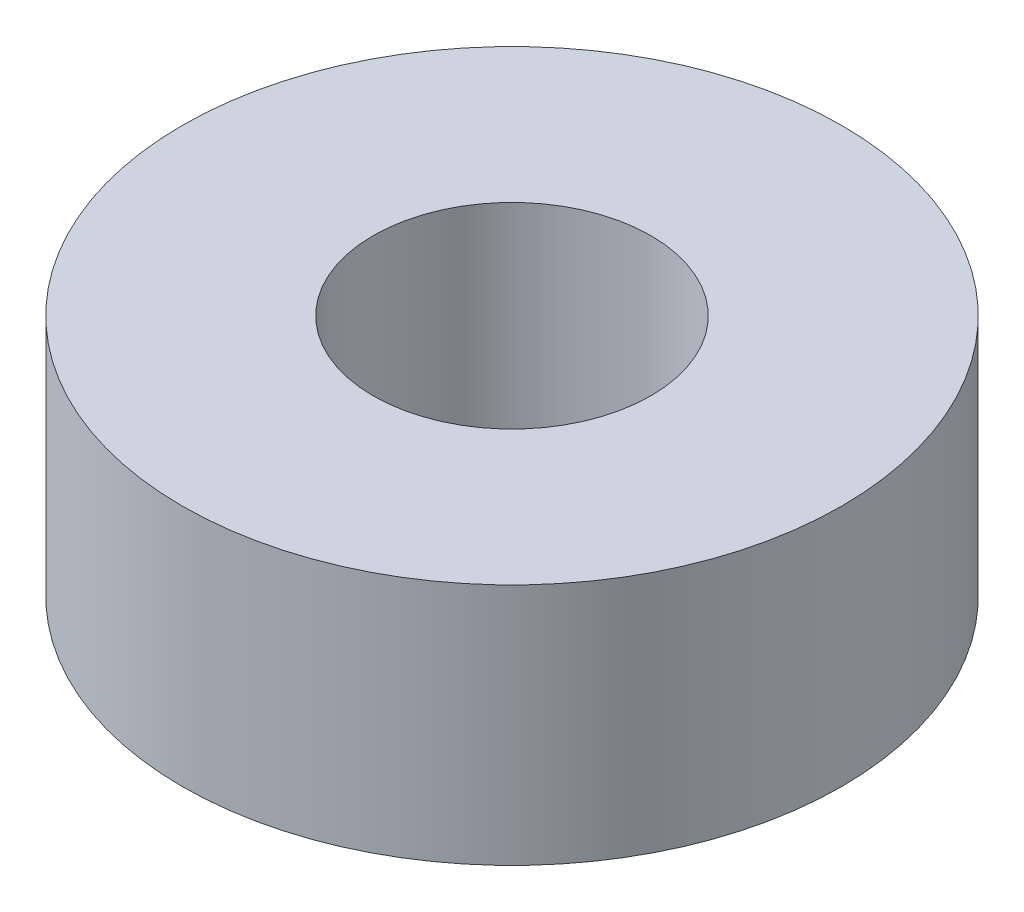
ISO-10303-21;
HEADER;
FILE_DESCRIPTION(('STEP AP214'),'2;1');
FILE_NAME('part.step','',(''),(''),'','','');
FILE_SCHEMA(('AUTOMOTIVE_DESIGN { 1 0 10303 214 1 1 1 1 }'));
ENDSEC;
DATA;
#1=APPLICATION_CONTEXT('core data for automotive mechanical design processes');
#2=APPLICATION_PROTOCOL_DEFINITION('international standard','automotive_design',2000,#1);
#3=PRODUCT_CONTEXT('',#1,'mechanical');
#4=PRODUCT('Part','Part','',(#3));
#5=PRODUCT_RELATED_PRODUCT_CATEGORY('part','',(#4));
#6=PRODUCT_DEFINITION_FORMATION('','',#4);
#7=PRODUCT_DEFINITION_CONTEXT('part definition',#1,'design');
#8=PRODUCT_DEFINITION('design','',#6,#7);
#9=PRODUCT_DEFINITION_SHAPE('','',#8);
#10=(LENGTH_UNIT() NAMED_UNIT(*) SI_UNIT(.MILLI.,.METRE.));
#11=(NAMED_UNIT(*) PLANE_ANGLE_UNIT() SI_UNIT($,.RADIAN.));
#12=(NAMED_UNIT(*) SI_UNIT($,.STERADIAN.) SOLID_ANGLE_UNIT());
#13=UNCERTAINTY_MEASURE_WITH_UNIT(LENGTH_MEASURE(1.E-05),#10,'distance_accuracy_value','');
#14=(GEOMETRIC_REPRESENTATION_CONTEXT(3) GLOBAL_UNCERTAINTY_ASSIGNED_CONTEXT((#13)) GLOBAL_UNIT_ASSIGNED_CONTEXT((#10,
#11,#12)) REPRESENTATION_CONTEXT('',''));
#15=CARTESIAN_POINT('',(0.,0.,0.));
#16=DIRECTION('',(0.,0.,1.));
#17=DIRECTION('',(1.,0.,0.));
#18=AXIS2_PLACEMENT_3D('',#15,#16,#17);
#19=CARTESIAN_POINT('',(0.,7.,0.));
#20=DIRECTION('',(0.,1.,0.));
#21=DIRECTION('',(0.,0.,1.));
#22=AXIS2_PLACEMENT_3D('',#19,#20,#21);
#23=PLANE('',#22);
#24=CARTESIAN_POINT('',(0.,7.,0.));
#25=DIRECTION('',(0.,1.,0.));
#26=DIRECTION('',(0.,0.,1.));
#27=AXIS2_PLACEMENT_3D('',#24,#25,#26);
#28=CIRCLE('',#27,9.5);
#29=CARTESIAN_POINT('',(0.,7.,9.5));
#30=VERTEX_POINT('',#29);
#31=EDGE_CURVE('E10',#30,#30,#28,.T.);
#32=ORIENTED_EDGE('',*,*,#31,.T.);
#33=EDGE_LOOP('',(#32));
#34=FACE_BOUND('',#33,.T.);
#35=CARTESIAN_POINT('',(0.,7.,0.));
#36=DIRECTION('',(0.,1.,0.));
#37=DIRECTION('',(0.,0.,1.));
#38=AXIS2_PLACEMENT_3D('',#35,#36,#37);
#39=CIRCLE('',#38,4.);
#40=CARTESIAN_POINT('',(0.,7.,4.));
#41=VERTEX_POINT('',#40);
#42=EDGE_CURVE('E50',#41,#41,#39,.T.);
#43=ORIENTED_EDGE('',*,*,#42,.F.);
#44=EDGE_LOOP('',(#43));
#45=FACE_BOUND('',#44,.T.);
#46=ADVANCED_FACE('F37',(#34,#45),#23,.T.);
#47=CARTESIAN_POINT('',(0.,0.,0.));
#48=DIRECTION('',(0.,1.,0.));
#49=DIRECTION('',(0.,0.,1.));
#50=AXIS2_PLACEMENT_3D('',#47,#48,#49);
#51=PLANE('',#50);
#52=CARTESIAN_POINT('',(0.,0.,0.));
#53=DIRECTION('',(0.,1.,0.));
#54=DIRECTION('',(0.,0.,1.));
#55=AXIS2_PLACEMENT_3D('',#52,#53,#54);
#56=CIRCLE('',#55,9.5);
#57=CARTESIAN_POINT('',(0.,0.,9.5));
#58=VERTEX_POINT('',#57);
#59=EDGE_CURVE('E41',#58,#58,#56,.T.);
#60=ORIENTED_EDGE('',*,*,#59,.F.);
#61=EDGE_LOOP('',(#60));
#62=FACE_BOUND('',#61,.T.);
#63=CARTESIAN_POINT('',(0.,0.,0.));
#64=DIRECTION('',(0.,1.,0.));
#65=DIRECTION('',(0.,0.,1.));
#66=AXIS2_PLACEMENT_3D('',#63,#64,#65);
#67=CIRCLE('',#66,4.);
#68=CARTESIAN_POINT('',(0.,0.,4.));
#69=VERTEX_POINT('',#68);
#70=EDGE_CURVE('E52',#69,#69,#67,.T.);
#71=ORIENTED_EDGE('',*,*,#70,.T.);
#72=EDGE_LOOP('',(#71));
#73=FACE_BOUND('',#72,.T.);
#74=ADVANCED_FACE('F64',(#62,#73),#51,.F.);
#75=CARTESIAN_POINT('',(0.,7.,0.));
#76=DIRECTION('',(0.,-1.,0.));
#77=DIRECTION('',(0.,0.,-1.));
#78=AXIS2_PLACEMENT_3D('',#75,#76,#77);
#79=CYLINDRICAL_SURFACE('',#78,9.5);
#80=ORIENTED_EDGE('',*,*,#31,.F.);
#81=EDGE_LOOP('',(#80));
#82=FACE_BOUND('',#81,.T.);
#83=ORIENTED_EDGE('',*,*,#59,.T.);
#84=EDGE_LOOP('',(#83));
#85=FACE_BOUND('',#84,.T.);
#86=ADVANCED_FACE('F39',(#82,#85),#79,.T.);
#87=CARTESIAN_POINT('',(0.,7.,0.));
#88=DIRECTION('',(0.,-1.,0.));
#89=DIRECTION('',(0.,0.,-1.));
#90=AXIS2_PLACEMENT_3D('',#87,#88,#89);
#91=CYLINDRICAL_SURFACE('',#90,4.);
#92=ORIENTED_EDGE('',*,*,#42,.T.);
#93=EDGE_LOOP('',(#92));
#94=FACE_BOUND('',#93,.T.);
#95=ORIENTED_EDGE('',*,*,#70,.F.);
#96=EDGE_LOOP('',(#95));
#97=FACE_BOUND('',#96,.T.);
#98=ADVANCED_FACE('F60',(#94,#97),#91,.F.);
#99=CLOSED_SHELL('',(#46,#74,#86,#98));
#100=MANIFOLD_SOLID_BREP('B2',#99);
#101=ADVANCED_BREP_SHAPE_REPRESENTATION('',(#18,#100),#14);
#102=SHAPE_DEFINITION_REPRESENTATION(#9,#101);
ENDSEC;
END-ISO-10303-21;
